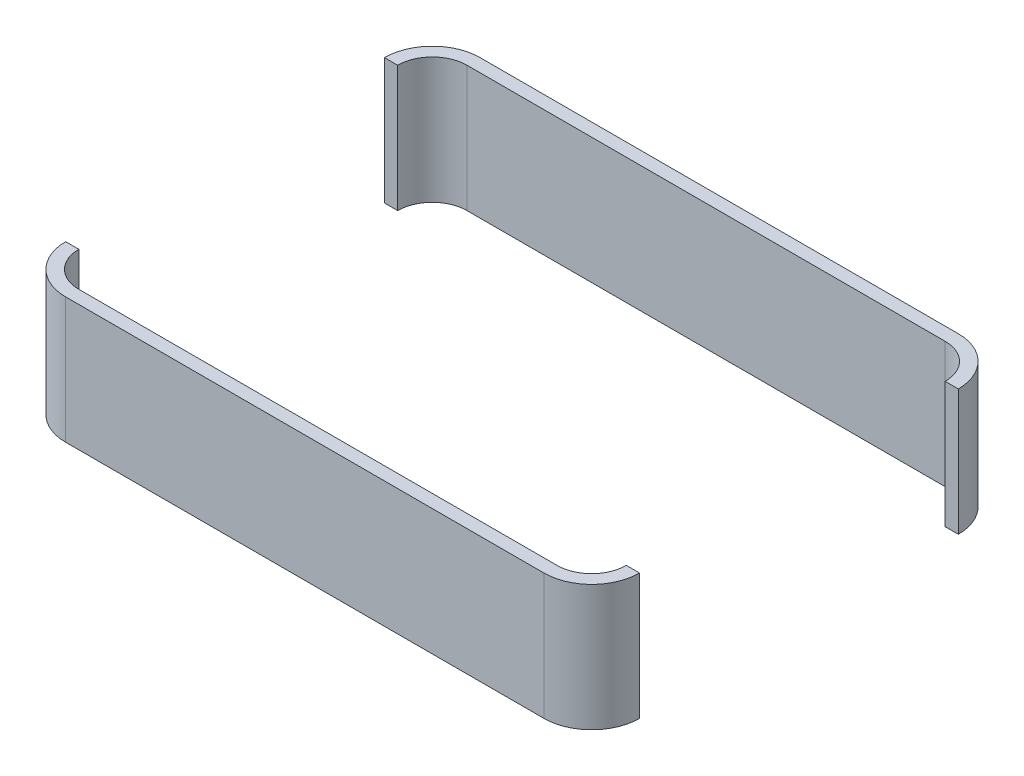
ISO-10303-21;
HEADER;
FILE_DESCRIPTION(('STEP AP214'),'2;1');
FILE_NAME('part.step','',(''),(''),'','','');
FILE_SCHEMA(('AUTOMOTIVE_DESIGN { 1 0 10303 214 1 1 1 1 }'));
ENDSEC;
DATA;
#1=APPLICATION_CONTEXT('core data for automotive mechanical design processes');
#2=APPLICATION_PROTOCOL_DEFINITION('international standard','automotive_design',2000,#1);
#3=PRODUCT_CONTEXT('',#1,'mechanical');
#4=PRODUCT('Part','Part','',(#3));
#5=PRODUCT_RELATED_PRODUCT_CATEGORY('part','',(#4));
#6=PRODUCT_DEFINITION_FORMATION('','',#4);
#7=PRODUCT_DEFINITION_CONTEXT('part definition',#1,'design');
#8=PRODUCT_DEFINITION('design','',#6,#7);
#9=PRODUCT_DEFINITION_SHAPE('','',#8);
#10=(LENGTH_UNIT() NAMED_UNIT(*) SI_UNIT(.MILLI.,.METRE.));
#11=(NAMED_UNIT(*) PLANE_ANGLE_UNIT() SI_UNIT($,.RADIAN.));
#12=(NAMED_UNIT(*) SI_UNIT($,.STERADIAN.) SOLID_ANGLE_UNIT());
#13=UNCERTAINTY_MEASURE_WITH_UNIT(LENGTH_MEASURE(1.E-05),#10,'distance_accuracy_value','');
#14=(GEOMETRIC_REPRESENTATION_CONTEXT(3) GLOBAL_UNCERTAINTY_ASSIGNED_CONTEXT((#13)) GLOBAL_UNIT_ASSIGNED_CONTEXT((#10,
#11,#12)) REPRESENTATION_CONTEXT('',''));
#15=CARTESIAN_POINT('',(0.,0.,0.));
#16=DIRECTION('',(0.,0.,1.));
#17=DIRECTION('',(1.,0.,0.));
#18=AXIS2_PLACEMENT_3D('',#15,#16,#17);
#19=CARTESIAN_POINT('',(180.,81.8333333375,-152.966732087882));
#20=DIRECTION('',(0.,0.,-1.));
#21=DIRECTION('',(1.,0.,0.));
#22=AXIS2_PLACEMENT_3D('',#19,#20,#21);
#23=PLANE('',#22);
#24=DIRECTION('',(-1.,0.,0.));
#25=VECTOR('',#24,1.);
#26=CARTESIAN_POINT('',(180.,2.8333333325,-152.966732087882));
#27=LINE('',#26,#25);
#28=CARTESIAN_POINT('',(180.,2.8333333325,-152.966732087882));
#29=VERTEX_POINT('',#28);
#30=CARTESIAN_POINT('',(171.75,2.8333333325,-152.966732087882));
#31=VERTEX_POINT('',#30);
#32=EDGE_CURVE('E151',#29,#31,#27,.T.);
#33=ORIENTED_EDGE('',*,*,#32,.F.);
#34=DIRECTION('',(0.,-1.,0.));
#35=VECTOR('',#34,1.);
#36=CARTESIAN_POINT('',(180.,81.8333333375,-152.966732087882));
#37=LINE('',#36,#35);
#38=CARTESIAN_POINT('',(180.,81.8333333375,-152.966732087882));
#39=VERTEX_POINT('',#38);
#40=EDGE_CURVE('E181',#39,#29,#37,.T.);
#41=ORIENTED_EDGE('',*,*,#40,.F.);
#42=DIRECTION('',(-1.,0.,0.));
#43=VECTOR('',#42,1.);
#44=CARTESIAN_POINT('',(180.,81.8333333375,-152.966732087882));
#45=LINE('',#44,#43);
#46=CARTESIAN_POINT('',(171.75,81.8333333375,-152.966732087882));
#47=VERTEX_POINT('',#46);
#48=EDGE_CURVE('E169',#39,#47,#45,.T.);
#49=ORIENTED_EDGE('',*,*,#48,.T.);
#50=DIRECTION('',(0.,-1.,0.));
#51=VECTOR('',#50,1.);
#52=CARTESIAN_POINT('',(171.75,81.8333333375,-152.966732087882));
#53=LINE('',#52,#51);
#54=EDGE_CURVE('E178',#47,#31,#53,.T.);
#55=ORIENTED_EDGE('',*,*,#54,.T.);
#56=EDGE_LOOP('',(#33,#41,#49,#55));
#57=FACE_BOUND('',#56,.T.);
#58=ADVANCED_FACE('F54',(#57),#23,.F.);
#59=CARTESIAN_POINT('',(150.,81.8333333375,-152.966732087882));
#60=DIRECTION('',(0.,-1.,0.));
#61=DIRECTION('',(0.,0.,1.));
#62=AXIS2_PLACEMENT_3D('',#59,#60,#61);
#63=CYLINDRICAL_SURFACE('',#62,30.);
#64=CARTESIAN_POINT('',(150.,2.8333333325,-152.966732087882));
#65=DIRECTION('',(0.,-1.,0.));
#66=DIRECTION('',(0.,0.,-1.));
#67=AXIS2_PLACEMENT_3D('',#64,#65,#66);
#68=CIRCLE('',#67,30.);
#69=CARTESIAN_POINT('',(150.,2.8333333325,-182.966732087882));
#70=VERTEX_POINT('',#69);
#71=EDGE_CURVE('E62',#70,#29,#68,.T.);
#72=ORIENTED_EDGE('',*,*,#71,.F.);
#73=DIRECTION('',(0.,-1.,0.));
#74=VECTOR('',#73,1.);
#75=CARTESIAN_POINT('',(150.,81.8333333375,-182.966732087882));
#76=LINE('',#75,#74);
#77=CARTESIAN_POINT('',(150.,81.8333333375,-182.966732087882));
#78=VERTEX_POINT('',#77);
#79=EDGE_CURVE('E157',#78,#70,#76,.T.);
#80=ORIENTED_EDGE('',*,*,#79,.F.);
#81=CARTESIAN_POINT('',(150.,81.8333333375,-152.966732087882));
#82=DIRECTION('',(0.,-1.,0.));
#83=DIRECTION('',(0.,0.,-1.));
#84=AXIS2_PLACEMENT_3D('',#81,#82,#83);
#85=CIRCLE('',#84,30.);
#86=EDGE_CURVE('E110',#78,#39,#85,.T.);
#87=ORIENTED_EDGE('',*,*,#86,.T.);
#88=ORIENTED_EDGE('',*,*,#40,.T.);
#89=EDGE_LOOP('',(#72,#80,#87,#88));
#90=FACE_BOUND('',#89,.T.);
#91=ADVANCED_FACE('F189',(#90),#63,.T.);
#92=CARTESIAN_POINT('',(150.,81.8333333375,-152.966732087882));
#93=DIRECTION('',(0.,-1.,0.));
#94=DIRECTION('',(0.,0.,1.));
#95=AXIS2_PLACEMENT_3D('',#92,#93,#94);
#96=CYLINDRICAL_SURFACE('',#95,21.75);
#97=CARTESIAN_POINT('',(150.,2.8333333325,-152.966732087882));
#98=DIRECTION('',(0.,1.,0.));
#99=DIRECTION('',(0.,0.,-1.));
#100=AXIS2_PLACEMENT_3D('',#97,#98,#99);
#101=CIRCLE('',#100,21.75);
#102=CARTESIAN_POINT('',(150.,2.8333333325,-174.716732087882));
#103=VERTEX_POINT('',#102);
#104=EDGE_CURVE('E146',#31,#103,#101,.T.);
#105=ORIENTED_EDGE('',*,*,#104,.F.);
#106=ORIENTED_EDGE('',*,*,#54,.F.);
#107=CARTESIAN_POINT('',(150.,81.8333333375,-152.966732087882));
#108=DIRECTION('',(0.,1.,0.));
#109=DIRECTION('',(0.,0.,-1.));
#110=AXIS2_PLACEMENT_3D('',#107,#108,#109);
#111=CIRCLE('',#110,21.75);
#112=CARTESIAN_POINT('',(150.,81.8333333375,-174.716732087882));
#113=VERTEX_POINT('',#112);
#114=EDGE_CURVE('E166',#47,#113,#111,.T.);
#115=ORIENTED_EDGE('',*,*,#114,.T.);
#116=DIRECTION('',(0.,-1.,0.));
#117=VECTOR('',#116,1.);
#118=CARTESIAN_POINT('',(150.,81.8333333375,-174.716732087882));
#119=LINE('',#118,#117);
#120=EDGE_CURVE('E175',#113,#103,#119,.T.);
#121=ORIENTED_EDGE('',*,*,#120,.T.);
#122=EDGE_LOOP('',(#105,#106,#115,#121));
#123=FACE_BOUND('',#122,.T.);
#124=ADVANCED_FACE('F195',(#123),#96,.F.);
#125=CARTESIAN_POINT('',(150.,2.8333333325,-152.966732087882));
#126=DIRECTION('',(0.,1.,0.));
#127=DIRECTION('',(0.,0.,-1.));
#128=AXIS2_PLACEMENT_3D('',#125,#126,#127);
#129=PLANE('',#128);
#130=ORIENTED_EDGE('',*,*,#71,.T.);
#131=ORIENTED_EDGE('',*,*,#32,.T.);
#132=ORIENTED_EDGE('',*,*,#104,.T.);
#133=DIRECTION('',(-1.,0.,0.));
#134=VECTOR('',#133,1.);
#135=CARTESIAN_POINT('',(0.,2.8333333325,-174.716732087882));
#136=LINE('',#135,#134);
#137=CARTESIAN_POINT('',(-150.,2.8333333325,-174.716732087882));
#138=VERTEX_POINT('',#137);
#139=EDGE_CURVE('E144',#103,#138,#136,.T.);
#140=ORIENTED_EDGE('',*,*,#139,.T.);
#141=CARTESIAN_POINT('',(-150.,2.8333333325,-152.966732087882));
#142=DIRECTION('',(0.,1.,0.));
#143=DIRECTION('',(0.,0.,1.));
#144=AXIS2_PLACEMENT_3D('',#141,#142,#143);
#145=CIRCLE('',#144,21.75);
#146=CARTESIAN_POINT('',(-171.75,2.8333333325,-152.966732087882));
#147=VERTEX_POINT('',#146);
#148=EDGE_CURVE('E131',#138,#147,#145,.T.);
#149=ORIENTED_EDGE('',*,*,#148,.T.);
#150=DIRECTION('',(-1.,0.,0.));
#151=VECTOR('',#150,1.);
#152=CARTESIAN_POINT('',(-180.,2.8333333325,-152.966732087882));
#153=LINE('',#152,#151);
#154=CARTESIAN_POINT('',(-180.,2.8333333325,-152.966732087882));
#155=VERTEX_POINT('',#154);
#156=EDGE_CURVE('E139',#147,#155,#153,.T.);
#157=ORIENTED_EDGE('',*,*,#156,.T.);
#158=CARTESIAN_POINT('',(-150.,2.8333333325,-152.966732087882));
#159=DIRECTION('',(0.,-1.,0.));
#160=DIRECTION('',(0.,0.,-1.));
#161=AXIS2_PLACEMENT_3D('',#158,#159,#160);
#162=CIRCLE('',#161,30.);
#163=CARTESIAN_POINT('',(-150.,2.8333333325,-182.966732087882));
#164=VERTEX_POINT('',#163);
#165=EDGE_CURVE('E183',#164,#155,#162,.F.);
#166=ORIENTED_EDGE('',*,*,#165,.F.);
#167=DIRECTION('',(1.,0.,0.));
#168=VECTOR('',#167,1.);
#169=CARTESIAN_POINT('',(0.,2.8333333325,-182.966732087882));
#170=LINE('',#169,#168);
#171=EDGE_CURVE('E115',#164,#70,#170,.T.);
#172=ORIENTED_EDGE('',*,*,#171,.T.);
#173=EDGE_LOOP('',(#130,#131,#132,#140,#149,#157,#166,#172));
#174=FACE_BOUND('',#173,.T.);
#175=ADVANCED_FACE('F142',(#174),#129,.F.);
#176=CARTESIAN_POINT('',(150.,81.8333333375,-152.966732087882));
#177=DIRECTION('',(0.,1.,0.));
#178=DIRECTION('',(0.,0.,-1.));
#179=AXIS2_PLACEMENT_3D('',#176,#177,#178);
#180=PLANE('',#179);
#181=ORIENTED_EDGE('',*,*,#86,.F.);
#182=DIRECTION('',(1.,0.,0.));
#183=VECTOR('',#182,1.);
#184=CARTESIAN_POINT('',(0.,81.8333333375,-182.966732087882));
#185=LINE('',#184,#183);
#186=CARTESIAN_POINT('',(-150.,81.8333333375,-182.966732087882));
#187=VERTEX_POINT('',#186);
#188=EDGE_CURVE('E154',#187,#78,#185,.T.);
#189=ORIENTED_EDGE('',*,*,#188,.F.);
#190=CARTESIAN_POINT('',(-150.,81.8333333375,-152.966732087882));
#191=DIRECTION('',(0.,-1.,0.));
#192=DIRECTION('',(0.,0.,1.));
#193=AXIS2_PLACEMENT_3D('',#190,#191,#192);
#194=CIRCLE('',#193,30.);
#195=CARTESIAN_POINT('',(-180.,81.8333333375,-152.966732087882));
#196=VERTEX_POINT('',#195);
#197=EDGE_CURVE('E156',#196,#187,#194,.T.);
#198=ORIENTED_EDGE('',*,*,#197,.F.);
#199=DIRECTION('',(-1.,0.,0.));
#200=VECTOR('',#199,1.);
#201=CARTESIAN_POINT('',(-180.,81.8333333375,-152.966732087882));
#202=LINE('',#201,#200);
#203=CARTESIAN_POINT('',(-171.75,81.8333333375,-152.966732087882));
#204=VERTEX_POINT('',#203);
#205=EDGE_CURVE('E160',#204,#196,#202,.T.);
#206=ORIENTED_EDGE('',*,*,#205,.F.);
#207=CARTESIAN_POINT('',(-150.,81.8333333375,-152.966732087882));
#208=DIRECTION('',(0.,1.,0.));
#209=DIRECTION('',(0.,0.,1.));
#210=AXIS2_PLACEMENT_3D('',#207,#208,#209);
#211=CIRCLE('',#210,21.75);
#212=CARTESIAN_POINT('',(-150.,81.8333333375,-174.716732087882));
#213=VERTEX_POINT('',#212);
#214=EDGE_CURVE('E134',#213,#204,#211,.T.);
#215=ORIENTED_EDGE('',*,*,#214,.F.);
#216=DIRECTION('',(-1.,0.,0.));
#217=VECTOR('',#216,1.);
#218=CARTESIAN_POINT('',(0.,81.8333333375,-174.716732087882));
#219=LINE('',#218,#217);
#220=EDGE_CURVE('E163',#113,#213,#219,.T.);
#221=ORIENTED_EDGE('',*,*,#220,.F.);
#222=ORIENTED_EDGE('',*,*,#114,.F.);
#223=ORIENTED_EDGE('',*,*,#48,.F.);
#224=EDGE_LOOP('',(#181,#189,#198,#206,#215,#221,#222,#223));
#225=FACE_BOUND('',#224,.T.);
#226=ADVANCED_FACE('F200',(#225),#180,.T.);
#227=CARTESIAN_POINT('',(-180.,81.8333333375,-152.966732087882));
#228=DIRECTION('',(0.,0.,-1.));
#229=DIRECTION('',(1.,0.,0.));
#230=AXIS2_PLACEMENT_3D('',#227,#228,#229);
#231=PLANE('',#230);
#232=ORIENTED_EDGE('',*,*,#156,.F.);
#233=DIRECTION('',(0.,-1.,0.));
#234=VECTOR('',#233,1.);
#235=CARTESIAN_POINT('',(-171.75,81.8333333375,-152.966732087882));
#236=LINE('',#235,#234);
#237=EDGE_CURVE('E128',#204,#147,#236,.T.);
#238=ORIENTED_EDGE('',*,*,#237,.F.);
#239=ORIENTED_EDGE('',*,*,#205,.T.);
#240=DIRECTION('',(0.,-1.,0.));
#241=VECTOR('',#240,1.);
#242=CARTESIAN_POINT('',(-180.,81.8333333375,-152.966732087882));
#243=LINE('',#242,#241);
#244=EDGE_CURVE('E69',#196,#155,#243,.T.);
#245=ORIENTED_EDGE('',*,*,#244,.T.);
#246=EDGE_LOOP('',(#232,#238,#239,#245));
#247=FACE_BOUND('',#246,.T.);
#248=ADVANCED_FACE('F140',(#247),#231,.F.);
#249=CARTESIAN_POINT('',(-150.,81.8333333375,-152.966732087882));
#250=DIRECTION('',(0.,-1.,0.));
#251=DIRECTION('',(0.,0.,1.));
#252=AXIS2_PLACEMENT_3D('',#249,#250,#251);
#253=CYLINDRICAL_SURFACE('',#252,21.75);
#254=ORIENTED_EDGE('',*,*,#148,.F.);
#255=DIRECTION('',(0.,-1.,0.));
#256=VECTOR('',#255,1.);
#257=CARTESIAN_POINT('',(-150.,81.8333333375,-174.716732087882));
#258=LINE('',#257,#256);
#259=EDGE_CURVE('E136',#213,#138,#258,.T.);
#260=ORIENTED_EDGE('',*,*,#259,.F.);
#261=ORIENTED_EDGE('',*,*,#214,.T.);
#262=ORIENTED_EDGE('',*,*,#237,.T.);
#263=EDGE_LOOP('',(#254,#260,#261,#262));
#264=FACE_BOUND('',#263,.T.);
#265=ADVANCED_FACE('F129',(#264),#253,.F.);
#266=CARTESIAN_POINT('',(0.,81.8333333375,-174.716732087882));
#267=DIRECTION('',(0.,0.,-1.));
#268=DIRECTION('',(1.,0.,0.));
#269=AXIS2_PLACEMENT_3D('',#266,#267,#268);
#270=PLANE('',#269);
#271=ORIENTED_EDGE('',*,*,#139,.F.);
#272=ORIENTED_EDGE('',*,*,#120,.F.);
#273=ORIENTED_EDGE('',*,*,#220,.T.);
#274=ORIENTED_EDGE('',*,*,#259,.T.);
#275=EDGE_LOOP('',(#271,#272,#273,#274));
#276=FACE_BOUND('',#275,.T.);
#277=ADVANCED_FACE('F198',(#276),#270,.F.);
#278=CARTESIAN_POINT('',(-150.,2.8333333325,-152.966732087882));
#279=DIRECTION('',(0.,-1.,0.));
#280=DIRECTION('',(0.,0.,1.));
#281=AXIS2_PLACEMENT_3D('',#278,#279,#280);
#282=CYLINDRICAL_SURFACE('',#281,30.);
#283=ORIENTED_EDGE('',*,*,#165,.T.);
#284=ORIENTED_EDGE('',*,*,#244,.F.);
#285=ORIENTED_EDGE('',*,*,#197,.T.);
#286=DIRECTION('',(0.,-1.,0.));
#287=VECTOR('',#286,1.);
#288=CARTESIAN_POINT('',(-150.,2.8333333325,-182.966732087882));
#289=LINE('',#288,#287);
#290=EDGE_CURVE('E12',#187,#164,#289,.T.);
#291=ORIENTED_EDGE('',*,*,#290,.T.);
#292=EDGE_LOOP('',(#283,#284,#285,#291));
#293=FACE_BOUND('',#292,.T.);
#294=ADVANCED_FACE('F56',(#293),#282,.T.);
#295=CARTESIAN_POINT('',(-180.,2.8333333325,-182.966732087882));
#296=DIRECTION('',(0.,0.,1.));
#297=DIRECTION('',(-1.,0.,0.));
#298=AXIS2_PLACEMENT_3D('',#295,#296,#297);
#299=PLANE('',#298);
#300=ORIENTED_EDGE('',*,*,#290,.F.);
#301=ORIENTED_EDGE('',*,*,#188,.T.);
#302=ORIENTED_EDGE('',*,*,#79,.T.);
#303=ORIENTED_EDGE('',*,*,#171,.F.);
#304=EDGE_LOOP('',(#300,#301,#302,#303));
#305=FACE_BOUND('',#304,.T.);
#306=ADVANCED_FACE('F188',(#305),#299,.F.);
#307=CLOSED_SHELL('',(#58,#91,#124,#175,#226,#248,#265,#277,#294,#306));
#308=MANIFOLD_SOLID_BREP('B2',#307);
#309=CARTESIAN_POINT('',(180.,81.8333333375,47.0332679121184));
#310=DIRECTION('',(0.,0.,1.));
#311=DIRECTION('',(1.,0.,0.));
#312=AXIS2_PLACEMENT_3D('',#309,#310,#311);
#313=PLANE('',#312);
#314=DIRECTION('',(-1.,0.,0.));
#315=VECTOR('',#314,1.);
#316=CARTESIAN_POINT('',(180.,2.8333333325,47.0332679121184));
#317=LINE('',#316,#315);
#318=CARTESIAN_POINT('',(180.,2.8333333325,47.0332679121184));
#319=VERTEX_POINT('',#318);
#320=CARTESIAN_POINT('',(171.75,2.8333333325,47.0332679121184));
#321=VERTEX_POINT('',#320);
#322=EDGE_CURVE('E340',#319,#321,#317,.T.);
#323=ORIENTED_EDGE('',*,*,#322,.T.);
#324=DIRECTION('',(0.,-1.,0.));
#325=VECTOR('',#324,1.);
#326=CARTESIAN_POINT('',(171.75,81.8333333375,47.0332679121184));
#327=LINE('',#326,#325);
#328=CARTESIAN_POINT('',(171.75,81.8333333375,47.0332679121184));
#329=VERTEX_POINT('',#328);
#330=EDGE_CURVE('E468',#329,#321,#327,.T.);
#331=ORIENTED_EDGE('',*,*,#330,.F.);
#332=DIRECTION('',(-1.,0.,0.));
#333=VECTOR('',#332,1.);
#334=CARTESIAN_POINT('',(180.,81.8333333375,47.0332679121184));
#335=LINE('',#334,#333);
#336=CARTESIAN_POINT('',(180.,81.8333333375,47.0332679121184));
#337=VERTEX_POINT('',#336);
#338=EDGE_CURVE('E372',#337,#329,#335,.T.);
#339=ORIENTED_EDGE('',*,*,#338,.F.);
#340=DIRECTION('',(0.,-1.,0.));
#341=VECTOR('',#340,1.);
#342=CARTESIAN_POINT('',(180.,81.8333333375,47.0332679121184));
#343=LINE('',#342,#341);
#344=EDGE_CURVE('E465',#337,#319,#343,.T.);
#345=ORIENTED_EDGE('',*,*,#344,.T.);
#346=EDGE_LOOP('',(#323,#331,#339,#345));
#347=FACE_BOUND('',#346,.T.);
#348=ADVANCED_FACE('F316',(#347),#313,.F.);
#349=CARTESIAN_POINT('',(150.,81.8333333375,47.0332679121184));
#350=DIRECTION('',(0.,-1.,0.));
#351=DIRECTION('',(0.,0.,-1.));
#352=AXIS2_PLACEMENT_3D('',#349,#350,#351);
#353=CYLINDRICAL_SURFACE('',#352,30.);
#354=CARTESIAN_POINT('',(150.,2.8333333325,47.0332679121184));
#355=DIRECTION('',(0.,1.,0.));
#356=DIRECTION('',(0.,0.,1.));
#357=AXIS2_PLACEMENT_3D('',#354,#355,#356);
#358=CIRCLE('',#357,30.);
#359=CARTESIAN_POINT('',(150.,2.8333333325,77.0332679121184));
#360=VERTEX_POINT('',#359);
#361=EDGE_CURVE('E325',#360,#319,#358,.T.);
#362=ORIENTED_EDGE('',*,*,#361,.T.);
#363=ORIENTED_EDGE('',*,*,#344,.F.);
#364=CARTESIAN_POINT('',(150.,81.8333333375,47.0332679121184));
#365=DIRECTION('',(0.,1.,0.));
#366=DIRECTION('',(0.,0.,1.));
#367=AXIS2_PLACEMENT_3D('',#364,#365,#366);
#368=CIRCLE('',#367,30.);
#369=CARTESIAN_POINT('',(150.,81.8333333375,77.0332679121184));
#370=VERTEX_POINT('',#369);
#371=EDGE_CURVE('E427',#370,#337,#368,.T.);
#372=ORIENTED_EDGE('',*,*,#371,.F.);
#373=DIRECTION('',(0.,-1.,0.));
#374=VECTOR('',#373,1.);
#375=CARTESIAN_POINT('',(150.,81.8333333375,77.0332679121184));
#376=LINE('',#375,#374);
#377=EDGE_CURVE('E417',#370,#360,#376,.T.);
#378=ORIENTED_EDGE('',*,*,#377,.T.);
#379=EDGE_LOOP('',(#362,#363,#372,#378));
#380=FACE_BOUND('',#379,.T.);
#381=ADVANCED_FACE('F466',(#380),#353,.T.);
#382=CARTESIAN_POINT('',(150.,81.8333333375,47.0332679121184));
#383=DIRECTION('',(0.,-1.,0.));
#384=DIRECTION('',(0.,0.,-1.));
#385=AXIS2_PLACEMENT_3D('',#382,#383,#384);
#386=CYLINDRICAL_SURFACE('',#385,21.75);
#387=CARTESIAN_POINT('',(150.,2.8333333325,47.0332679121184));
#388=DIRECTION('',(0.,-1.,0.));
#389=DIRECTION('',(0.,0.,1.));
#390=AXIS2_PLACEMENT_3D('',#387,#388,#389);
#391=CIRCLE('',#390,21.75);
#392=CARTESIAN_POINT('',(150.,2.8333333325,68.7832679121184));
#393=VERTEX_POINT('',#392);
#394=EDGE_CURVE('E431',#321,#393,#391,.T.);
#395=ORIENTED_EDGE('',*,*,#394,.T.);
#396=DIRECTION('',(0.,-1.,0.));
#397=VECTOR('',#396,1.);
#398=CARTESIAN_POINT('',(150.,81.8333333375,68.7832679121184));
#399=LINE('',#398,#397);
#400=CARTESIAN_POINT('',(150.,81.8333333375,68.7832679121184));
#401=VERTEX_POINT('',#400);
#402=EDGE_CURVE('E419',#401,#393,#399,.T.);
#403=ORIENTED_EDGE('',*,*,#402,.F.);
#404=CARTESIAN_POINT('',(150.,81.8333333375,47.0332679121184));
#405=DIRECTION('',(0.,-1.,0.));
#406=DIRECTION('',(0.,0.,1.));
#407=AXIS2_PLACEMENT_3D('',#404,#405,#406);
#408=CIRCLE('',#407,21.75);
#409=EDGE_CURVE('E454',#329,#401,#408,.T.);
#410=ORIENTED_EDGE('',*,*,#409,.F.);
#411=ORIENTED_EDGE('',*,*,#330,.T.);
#412=EDGE_LOOP('',(#395,#403,#410,#411));
#413=FACE_BOUND('',#412,.T.);
#414=ADVANCED_FACE('F483',(#413),#386,.F.);
#415=CARTESIAN_POINT('',(150.,2.8333333325,47.0332679121184));
#416=DIRECTION('',(0.,1.,0.));
#417=DIRECTION('',(0.,0.,1.));
#418=AXIS2_PLACEMENT_3D('',#415,#416,#417);
#419=PLANE('',#418);
#420=ORIENTED_EDGE('',*,*,#361,.F.);
#421=DIRECTION('',(1.,0.,0.));
#422=VECTOR('',#421,1.);
#423=CARTESIAN_POINT('',(0.,2.8333333325,77.0332679121184));
#424=LINE('',#423,#422);
#425=CARTESIAN_POINT('',(-150.,2.8333333325,77.0332679121184));
#426=VERTEX_POINT('',#425);
#427=EDGE_CURVE('E378',#426,#360,#424,.T.);
#428=ORIENTED_EDGE('',*,*,#427,.F.);
#429=CARTESIAN_POINT('',(-150.,2.8333333325,47.0332679121184));
#430=DIRECTION('',(0.,1.,0.));
#431=DIRECTION('',(0.,0.,1.));
#432=AXIS2_PLACEMENT_3D('',#429,#430,#431);
#433=CIRCLE('',#432,30.);
#434=CARTESIAN_POINT('',(-180.,2.8333333325,47.0332679121184));
#435=VERTEX_POINT('',#434);
#436=EDGE_CURVE('E332',#426,#435,#433,.F.);
#437=ORIENTED_EDGE('',*,*,#436,.T.);
#438=DIRECTION('',(-1.,0.,0.));
#439=VECTOR('',#438,1.);
#440=CARTESIAN_POINT('',(-180.,2.8333333325,47.0332679121184));
#441=LINE('',#440,#439);
#442=CARTESIAN_POINT('',(-171.75,2.8333333325,47.0332679121184));
#443=VERTEX_POINT('',#442);
#444=EDGE_CURVE('E388',#443,#435,#441,.T.);
#445=ORIENTED_EDGE('',*,*,#444,.F.);
#446=CARTESIAN_POINT('',(-150.,2.8333333325,47.0332679121184));
#447=DIRECTION('',(0.,-1.,0.));
#448=DIRECTION('',(0.,0.,-1.));
#449=AXIS2_PLACEMENT_3D('',#446,#447,#448);
#450=CIRCLE('',#449,21.75);
#451=CARTESIAN_POINT('',(-150.,2.8333333325,68.7832679121184));
#452=VERTEX_POINT('',#451);
#453=EDGE_CURVE('E391',#452,#443,#450,.T.);
#454=ORIENTED_EDGE('',*,*,#453,.F.);
#455=DIRECTION('',(-1.,0.,0.));
#456=VECTOR('',#455,1.);
#457=CARTESIAN_POINT('',(0.,2.8333333325,68.7832679121184));
#458=LINE('',#457,#456);
#459=EDGE_CURVE('E408',#393,#452,#458,.T.);
#460=ORIENTED_EDGE('',*,*,#459,.F.);
#461=ORIENTED_EDGE('',*,*,#394,.F.);
#462=ORIENTED_EDGE('',*,*,#322,.F.);
#463=EDGE_LOOP('',(#420,#428,#437,#445,#454,#460,#461,#462));
#464=FACE_BOUND('',#463,.T.);
#465=ADVANCED_FACE('F390',(#464),#419,.F.);
#466=CARTESIAN_POINT('',(150.,81.8333333375,47.0332679121184));
#467=DIRECTION('',(0.,1.,0.));
#468=DIRECTION('',(0.,0.,1.));
#469=AXIS2_PLACEMENT_3D('',#466,#467,#468);
#470=PLANE('',#469);
#471=ORIENTED_EDGE('',*,*,#371,.T.);
#472=ORIENTED_EDGE('',*,*,#338,.T.);
#473=ORIENTED_EDGE('',*,*,#409,.T.);
#474=DIRECTION('',(-1.,0.,0.));
#475=VECTOR('',#474,1.);
#476=CARTESIAN_POINT('',(0.,81.8333333375,68.7832679121184));
#477=LINE('',#476,#475);
#478=CARTESIAN_POINT('',(-150.,81.8333333375,68.7832679121184));
#479=VERTEX_POINT('',#478);
#480=EDGE_CURVE('E451',#401,#479,#477,.T.);
#481=ORIENTED_EDGE('',*,*,#480,.T.);
#482=CARTESIAN_POINT('',(-150.,81.8333333375,47.0332679121184));
#483=DIRECTION('',(0.,-1.,0.));
#484=DIRECTION('',(0.,0.,-1.));
#485=AXIS2_PLACEMENT_3D('',#482,#483,#484);
#486=CIRCLE('',#485,21.75);
#487=CARTESIAN_POINT('',(-171.75,81.8333333375,47.0332679121184));
#488=VERTEX_POINT('',#487);
#489=EDGE_CURVE('E448',#479,#488,#486,.T.);
#490=ORIENTED_EDGE('',*,*,#489,.T.);
#491=DIRECTION('',(-1.,0.,0.));
#492=VECTOR('',#491,1.);
#493=CARTESIAN_POINT('',(-180.,81.8333333375,47.0332679121184));
#494=LINE('',#493,#492);
#495=CARTESIAN_POINT('',(-180.,81.8333333375,47.0332679121184));
#496=VERTEX_POINT('',#495);
#497=EDGE_CURVE('E411',#488,#496,#494,.T.);
#498=ORIENTED_EDGE('',*,*,#497,.T.);
#499=CARTESIAN_POINT('',(-150.,81.8333333375,47.0332679121184));
#500=DIRECTION('',(0.,1.,0.));
#501=DIRECTION('',(0.,0.,-1.));
#502=AXIS2_PLACEMENT_3D('',#499,#500,#501);
#503=CIRCLE('',#502,30.);
#504=CARTESIAN_POINT('',(-150.,81.8333333375,77.0332679121184));
#505=VERTEX_POINT('',#504);
#506=EDGE_CURVE('E442',#496,#505,#503,.T.);
#507=ORIENTED_EDGE('',*,*,#506,.T.);
#508=DIRECTION('',(1.,0.,0.));
#509=VECTOR('',#508,1.);
#510=CARTESIAN_POINT('',(0.,81.8333333375,77.0332679121184));
#511=LINE('',#510,#509);
#512=EDGE_CURVE('E425',#505,#370,#511,.T.);
#513=ORIENTED_EDGE('',*,*,#512,.T.);
#514=EDGE_LOOP('',(#471,#472,#473,#481,#490,#498,#507,#513));
#515=FACE_BOUND('',#514,.T.);
#516=ADVANCED_FACE('F462',(#515),#470,.T.);
#517=CARTESIAN_POINT('',(-180.,81.8333333375,47.0332679121184));
#518=DIRECTION('',(0.,0.,1.));
#519=DIRECTION('',(1.,0.,0.));
#520=AXIS2_PLACEMENT_3D('',#517,#518,#519);
#521=PLANE('',#520);
#522=ORIENTED_EDGE('',*,*,#444,.T.);
#523=DIRECTION('',(0.,-1.,0.));
#524=VECTOR('',#523,1.);
#525=CARTESIAN_POINT('',(-180.,81.8333333375,47.0332679121184));
#526=LINE('',#525,#524);
#527=EDGE_CURVE('E413',#496,#435,#526,.T.);
#528=ORIENTED_EDGE('',*,*,#527,.F.);
#529=ORIENTED_EDGE('',*,*,#497,.F.);
#530=DIRECTION('',(0.,-1.,0.));
#531=VECTOR('',#530,1.);
#532=CARTESIAN_POINT('',(-171.75,81.8333333375,47.0332679121184));
#533=LINE('',#532,#531);
#534=EDGE_CURVE('E403',#488,#443,#533,.T.);
#535=ORIENTED_EDGE('',*,*,#534,.T.);
#536=EDGE_LOOP('',(#522,#528,#529,#535));
#537=FACE_BOUND('',#536,.T.);
#538=ADVANCED_FACE('F410',(#537),#521,.F.);
#539=CARTESIAN_POINT('',(-150.,81.8333333375,47.0332679121184));
#540=DIRECTION('',(0.,-1.,0.));
#541=DIRECTION('',(0.,0.,-1.));
#542=AXIS2_PLACEMENT_3D('',#539,#540,#541);
#543=CYLINDRICAL_SURFACE('',#542,21.75);
#544=ORIENTED_EDGE('',*,*,#453,.T.);
#545=ORIENTED_EDGE('',*,*,#534,.F.);
#546=ORIENTED_EDGE('',*,*,#489,.F.);
#547=DIRECTION('',(0.,-1.,0.));
#548=VECTOR('',#547,1.);
#549=CARTESIAN_POINT('',(-150.,81.8333333375,68.7832679121184));
#550=LINE('',#549,#548);
#551=EDGE_CURVE('E406',#479,#452,#550,.T.);
#552=ORIENTED_EDGE('',*,*,#551,.T.);
#553=EDGE_LOOP('',(#544,#545,#546,#552));
#554=FACE_BOUND('',#553,.T.);
#555=ADVANCED_FACE('F401',(#554),#543,.F.);
#556=CARTESIAN_POINT('',(0.,81.8333333375,68.7832679121184));
#557=DIRECTION('',(0.,0.,1.));
#558=DIRECTION('',(1.,0.,0.));
#559=AXIS2_PLACEMENT_3D('',#556,#557,#558);
#560=PLANE('',#559);
#561=ORIENTED_EDGE('',*,*,#459,.T.);
#562=ORIENTED_EDGE('',*,*,#551,.F.);
#563=ORIENTED_EDGE('',*,*,#480,.F.);
#564=ORIENTED_EDGE('',*,*,#402,.T.);
#565=EDGE_LOOP('',(#561,#562,#563,#564));
#566=FACE_BOUND('',#565,.T.);
#567=ADVANCED_FACE('F480',(#566),#560,.F.);
#568=CARTESIAN_POINT('',(-150.,2.8333333325,47.0332679121184));
#569=DIRECTION('',(0.,-1.,0.));
#570=DIRECTION('',(0.,0.,-1.));
#571=AXIS2_PLACEMENT_3D('',#568,#569,#570);
#572=CYLINDRICAL_SURFACE('',#571,30.);
#573=ORIENTED_EDGE('',*,*,#436,.F.);
#574=DIRECTION('',(0.,-1.,0.));
#575=VECTOR('',#574,1.);
#576=CARTESIAN_POINT('',(-150.,2.8333333325,77.0332679121184));
#577=LINE('',#576,#575);
#578=EDGE_CURVE('E52',#505,#426,#577,.T.);
#579=ORIENTED_EDGE('',*,*,#578,.F.);
#580=ORIENTED_EDGE('',*,*,#506,.F.);
#581=ORIENTED_EDGE('',*,*,#527,.T.);
#582=EDGE_LOOP('',(#573,#579,#580,#581));
#583=FACE_BOUND('',#582,.T.);
#584=ADVANCED_FACE('F318',(#583),#572,.T.);
#585=CARTESIAN_POINT('',(-180.,2.8333333325,77.0332679121184));
#586=DIRECTION('',(0.,0.,-1.));
#587=DIRECTION('',(-1.,0.,0.));
#588=AXIS2_PLACEMENT_3D('',#585,#586,#587);
#589=PLANE('',#588);
#590=ORIENTED_EDGE('',*,*,#578,.T.);
#591=ORIENTED_EDGE('',*,*,#427,.T.);
#592=ORIENTED_EDGE('',*,*,#377,.F.);
#593=ORIENTED_EDGE('',*,*,#512,.F.);
#594=EDGE_LOOP('',(#590,#591,#592,#593));
#595=FACE_BOUND('',#594,.T.);
#596=ADVANCED_FACE('F502',(#595),#589,.F.);
#597=CLOSED_SHELL('',(#348,#381,#414,#465,#516,#538,#555,#567,#584,#596));
#598=MANIFOLD_SOLID_BREP('B6',#597);
#599=ADVANCED_BREP_SHAPE_REPRESENTATION('',(#18,#308,#598),#14);
#600=SHAPE_DEFINITION_REPRESENTATION(#9,#599);
ENDSEC;
END-ISO-10303-21;
